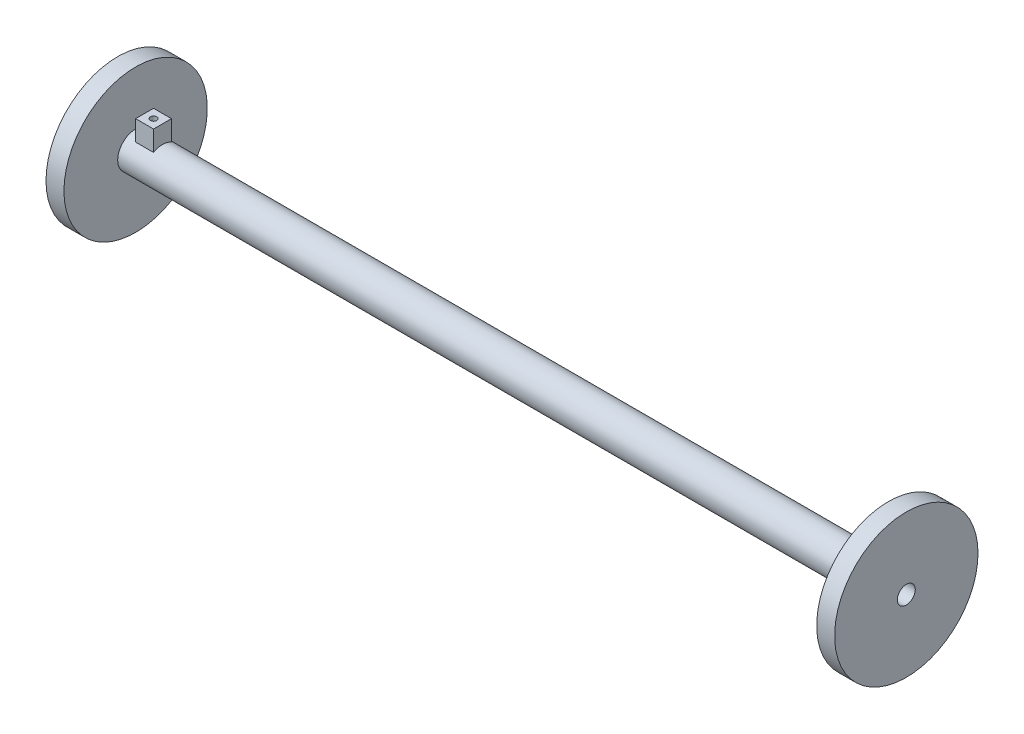
ISO-10303-21;
HEADER;
FILE_DESCRIPTION(('STEP AP214'),'2;1');
FILE_NAME('part.step','',(''),(''),'','','');
FILE_SCHEMA(('AUTOMOTIVE_DESIGN { 1 0 10303 214 1 1 1 1 }'));
ENDSEC;
DATA;
#1=APPLICATION_CONTEXT('core data for automotive mechanical design processes');
#2=APPLICATION_PROTOCOL_DEFINITION('international standard','automotive_design',2000,#1);
#3=PRODUCT_CONTEXT('',#1,'mechanical');
#4=PRODUCT('Part','Part','',(#3));
#5=PRODUCT_RELATED_PRODUCT_CATEGORY('part','',(#4));
#6=PRODUCT_DEFINITION_FORMATION('','',#4);
#7=PRODUCT_DEFINITION_CONTEXT('part definition',#1,'design');
#8=PRODUCT_DEFINITION('design','',#6,#7);
#9=PRODUCT_DEFINITION_SHAPE('','',#8);
#10=(LENGTH_UNIT() NAMED_UNIT(*) SI_UNIT(.MILLI.,.METRE.));
#11=(NAMED_UNIT(*) PLANE_ANGLE_UNIT() SI_UNIT($,.RADIAN.));
#12=(NAMED_UNIT(*) SI_UNIT($,.STERADIAN.) SOLID_ANGLE_UNIT());
#13=UNCERTAINTY_MEASURE_WITH_UNIT(LENGTH_MEASURE(1.E-05),#10,'distance_accuracy_value','');
#14=(GEOMETRIC_REPRESENTATION_CONTEXT(3) GLOBAL_UNCERTAINTY_ASSIGNED_CONTEXT((#13)) GLOBAL_UNIT_ASSIGNED_CONTEXT((#10,
#11,#12)) REPRESENTATION_CONTEXT('',''));
#15=CARTESIAN_POINT('',(0.,0.,0.));
#16=DIRECTION('',(0.,0.,1.));
#17=DIRECTION('',(1.,0.,0.));
#18=AXIS2_PLACEMENT_3D('',#15,#16,#17);
#19=CARTESIAN_POINT('',(279.4,0.,0.));
#20=DIRECTION('',(-1.,0.,0.));
#21=DIRECTION('',(0.,0.,1.));
#22=AXIS2_PLACEMENT_3D('',#19,#20,#21);
#23=CYLINDRICAL_SURFACE('',#22,12.7);
#24=CARTESIAN_POINT('',(-260.35,0.,0.));
#25=DIRECTION('',(-1.,0.,0.));
#26=DIRECTION('',(0.,0.,1.));
#27=AXIS2_PLACEMENT_3D('',#24,#25,#26);
#28=CIRCLE('',#27,12.7);
#29=CARTESIAN_POINT('',(-260.35,10.9985226280624,-6.35));
#30=VERTEX_POINT('',#29);
#31=CARTESIAN_POINT('',(-260.35,10.9985226280624,6.34999999999999));
#32=VERTEX_POINT('',#31);
#33=EDGE_CURVE('E110',#30,#32,#28,.F.);
#34=ORIENTED_EDGE('',*,*,#33,.F.);
#35=DIRECTION('',(-1.,0.,0.));
#36=VECTOR('',#35,1.);
#37=CARTESIAN_POINT('',(279.4,10.9985226280624,-6.35));
#38=LINE('',#37,#36);
#39=CARTESIAN_POINT('',(-247.65,10.9985226280855,-6.35));
#40=VERTEX_POINT('',#39);
#41=EDGE_CURVE('E100',#40,#30,#38,.T.);
#42=ORIENTED_EDGE('',*,*,#41,.F.);
#43=CARTESIAN_POINT('',(-247.65,0.,0.));
#44=DIRECTION('',(1.,0.,0.));
#45=DIRECTION('',(0.,0.,-1.));
#46=AXIS2_PLACEMENT_3D('',#43,#44,#45);
#47=CIRCLE('',#46,12.7);
#48=CARTESIAN_POINT('',(-247.65,10.9985226280855,6.34999999999999));
#49=VERTEX_POINT('',#48);
#50=EDGE_CURVE('E91',#49,#40,#47,.F.);
#51=ORIENTED_EDGE('',*,*,#50,.F.);
#52=DIRECTION('',(-1.,0.,0.));
#53=VECTOR('',#52,1.);
#54=CARTESIAN_POINT('',(279.4,10.9985226280624,6.34999999999999));
#55=LINE('',#54,#53);
#56=EDGE_CURVE('E106',#32,#49,#55,.F.);
#57=ORIENTED_EDGE('',*,*,#56,.F.);
#58=EDGE_LOOP('',(#34,#42,#51,#57));
#59=FACE_BOUND('',#58,.T.);
#60=CARTESIAN_POINT('',(266.7,0.,0.));
#61=DIRECTION('',(1.,0.,0.));
#62=DIRECTION('',(0.,0.,-1.));
#63=AXIS2_PLACEMENT_3D('',#60,#61,#62);
#64=CIRCLE('',#63,12.7);
#65=CARTESIAN_POINT('',(266.7,0.,-12.7));
#66=VERTEX_POINT('',#65);
#67=EDGE_CURVE('E130',#66,#66,#64,.T.);
#68=ORIENTED_EDGE('',*,*,#67,.F.);
#69=EDGE_LOOP('',(#68));
#70=FACE_BOUND('',#69,.T.);
#71=CARTESIAN_POINT('',(-266.7,0.,0.));
#72=DIRECTION('',(-1.,0.,0.));
#73=DIRECTION('',(0.,0.,1.));
#74=AXIS2_PLACEMENT_3D('',#71,#72,#73);
#75=CIRCLE('',#74,12.7);
#76=CARTESIAN_POINT('',(-266.7,0.,12.7));
#77=VERTEX_POINT('',#76);
#78=EDGE_CURVE('E57',#77,#77,#75,.T.);
#79=ORIENTED_EDGE('',*,*,#78,.F.);
#80=EDGE_LOOP('',(#79));
#81=FACE_BOUND('',#80,.T.);
#82=ADVANCED_FACE('F46',(#59,#70,#81),#23,.T.);
#83=CARTESIAN_POINT('',(279.4,0.,0.));
#84=DIRECTION('',(1.,0.,0.));
#85=DIRECTION('',(0.,0.,-1.));
#86=AXIS2_PLACEMENT_3D('',#83,#84,#85);
#87=PLANE('',#86);
#88=CARTESIAN_POINT('',(279.4,0.,0.));
#89=DIRECTION('',(1.,0.,0.));
#90=DIRECTION('',(0.,0.,-1.));
#91=AXIS2_PLACEMENT_3D('',#88,#89,#90);
#92=CIRCLE('',#91,6.35);
#93=CARTESIAN_POINT('',(279.4,0.,-6.35));
#94=VERTEX_POINT('',#93);
#95=EDGE_CURVE('E139',#94,#94,#92,.T.);
#96=ORIENTED_EDGE('',*,*,#95,.F.);
#97=EDGE_LOOP('',(#96));
#98=FACE_BOUND('',#97,.T.);
#99=CARTESIAN_POINT('',(279.4,0.,0.));
#100=DIRECTION('',(1.,0.,0.));
#101=DIRECTION('',(0.,0.,-1.));
#102=AXIS2_PLACEMENT_3D('',#99,#100,#101);
#103=CIRCLE('',#102,50.8);
#104=CARTESIAN_POINT('',(279.4,0.,-50.8));
#105=VERTEX_POINT('',#104);
#106=EDGE_CURVE('E123',#105,#105,#103,.T.);
#107=ORIENTED_EDGE('',*,*,#106,.T.);
#108=EDGE_LOOP('',(#107));
#109=FACE_BOUND('',#108,.T.);
#110=ADVANCED_FACE('F154',(#98,#109),#87,.T.);
#111=CARTESIAN_POINT('',(-279.4,0.,0.));
#112=DIRECTION('',(1.,0.,0.));
#113=DIRECTION('',(0.,0.,-1.));
#114=AXIS2_PLACEMENT_3D('',#111,#112,#113);
#115=PLANE('',#114);
#116=CARTESIAN_POINT('',(-279.4,0.,0.));
#117=DIRECTION('',(1.,0.,0.));
#118=DIRECTION('',(0.,0.,-1.));
#119=AXIS2_PLACEMENT_3D('',#116,#117,#118);
#120=CIRCLE('',#119,6.35);
#121=CARTESIAN_POINT('',(-279.4,0.,-6.35));
#122=VERTEX_POINT('',#121);
#123=EDGE_CURVE('E134',#122,#122,#120,.T.);
#124=ORIENTED_EDGE('',*,*,#123,.T.);
#125=EDGE_LOOP('',(#124));
#126=FACE_BOUND('',#125,.T.);
#127=CARTESIAN_POINT('',(-279.4,0.,0.));
#128=DIRECTION('',(-1.,0.,0.));
#129=DIRECTION('',(0.,0.,1.));
#130=AXIS2_PLACEMENT_3D('',#127,#128,#129);
#131=CIRCLE('',#130,50.8);
#132=CARTESIAN_POINT('',(-279.4,0.,50.8));
#133=VERTEX_POINT('',#132);
#134=EDGE_CURVE('E124',#133,#133,#131,.T.);
#135=ORIENTED_EDGE('',*,*,#134,.T.);
#136=EDGE_LOOP('',(#135));
#137=FACE_BOUND('',#136,.T.);
#138=ADVANCED_FACE('F144',(#126,#137),#115,.F.);
#139=CARTESIAN_POINT('',(279.4,0.,0.));
#140=DIRECTION('',(-1.,0.,0.));
#141=DIRECTION('',(0.,0.,1.));
#142=AXIS2_PLACEMENT_3D('',#139,#140,#141);
#143=CYLINDRICAL_SURFACE('',#142,6.35);
#144=ORIENTED_EDGE('',*,*,#123,.F.);
#145=EDGE_LOOP('',(#144));
#146=FACE_BOUND('',#145,.T.);
#147=ORIENTED_EDGE('',*,*,#95,.T.);
#148=EDGE_LOOP('',(#147));
#149=FACE_BOUND('',#148,.T.);
#150=ADVANCED_FACE('F147',(#146,#149),#143,.F.);
#151=CARTESIAN_POINT('',(266.7,0.,0.));
#152=DIRECTION('',(1.,0.,0.));
#153=DIRECTION('',(0.,0.,-1.));
#154=AXIS2_PLACEMENT_3D('',#151,#152,#153);
#155=PLANE('',#154);
#156=CARTESIAN_POINT('',(266.7,0.,0.));
#157=DIRECTION('',(1.,0.,0.));
#158=DIRECTION('',(0.,0.,-1.));
#159=AXIS2_PLACEMENT_3D('',#156,#157,#158);
#160=CIRCLE('',#159,50.8);
#161=CARTESIAN_POINT('',(266.7,0.,-50.8));
#162=VERTEX_POINT('',#161);
#163=EDGE_CURVE('E131',#162,#162,#160,.T.);
#164=ORIENTED_EDGE('',*,*,#163,.F.);
#165=EDGE_LOOP('',(#164));
#166=FACE_BOUND('',#165,.T.);
#167=ORIENTED_EDGE('',*,*,#67,.T.);
#168=EDGE_LOOP('',(#167));
#169=FACE_BOUND('',#168,.T.);
#170=ADVANCED_FACE('F150',(#166,#169),#155,.F.);
#171=CARTESIAN_POINT('',(266.7,0.,0.));
#172=DIRECTION('',(1.,0.,0.));
#173=DIRECTION('',(0.,0.,-1.));
#174=AXIS2_PLACEMENT_3D('',#171,#172,#173);
#175=CYLINDRICAL_SURFACE('',#174,50.8);
#176=ORIENTED_EDGE('',*,*,#163,.T.);
#177=EDGE_LOOP('',(#176));
#178=FACE_BOUND('',#177,.T.);
#179=ORIENTED_EDGE('',*,*,#106,.F.);
#180=EDGE_LOOP('',(#179));
#181=FACE_BOUND('',#180,.T.);
#182=ADVANCED_FACE('F160',(#178,#181),#175,.T.);
#183=CARTESIAN_POINT('',(-266.7,0.,0.));
#184=DIRECTION('',(-1.,0.,0.));
#185=DIRECTION('',(0.,0.,1.));
#186=AXIS2_PLACEMENT_3D('',#183,#184,#185);
#187=PLANE('',#186);
#188=CARTESIAN_POINT('',(-266.7,0.,0.));
#189=DIRECTION('',(-1.,0.,0.));
#190=DIRECTION('',(0.,0.,1.));
#191=AXIS2_PLACEMENT_3D('',#188,#189,#190);
#192=CIRCLE('',#191,50.8);
#193=CARTESIAN_POINT('',(-266.7,0.,50.8));
#194=VERTEX_POINT('',#193);
#195=EDGE_CURVE('E120',#194,#194,#192,.T.);
#196=ORIENTED_EDGE('',*,*,#195,.F.);
#197=EDGE_LOOP('',(#196));
#198=FACE_BOUND('',#197,.T.);
#199=ORIENTED_EDGE('',*,*,#78,.T.);
#200=EDGE_LOOP('',(#199));
#201=FACE_BOUND('',#200,.T.);
#202=ADVANCED_FACE('F162',(#198,#201),#187,.F.);
#203=CARTESIAN_POINT('',(-266.7,0.,0.));
#204=DIRECTION('',(-1.,0.,0.));
#205=DIRECTION('',(0.,0.,1.));
#206=AXIS2_PLACEMENT_3D('',#203,#204,#205);
#207=CYLINDRICAL_SURFACE('',#206,50.8);
#208=ORIENTED_EDGE('',*,*,#195,.T.);
#209=EDGE_LOOP('',(#208));
#210=FACE_BOUND('',#209,.T.);
#211=ORIENTED_EDGE('',*,*,#134,.F.);
#212=EDGE_LOOP('',(#211));
#213=FACE_BOUND('',#212,.T.);
#214=ADVANCED_FACE('F169',(#210,#213),#207,.T.);
#215=CARTESIAN_POINT('',(-260.35,-500000.,-6.35));
#216=DIRECTION('',(0.,0.,-1.));
#217=DIRECTION('',(-1.,0.,0.));
#218=AXIS2_PLACEMENT_3D('',#215,#216,#217);
#219=PLANE('',#218);
#220=DIRECTION('',(0.,1.,0.));
#221=VECTOR('',#220,1.);
#222=CARTESIAN_POINT('',(-247.65,-500000.,-6.35));
#223=LINE('',#222,#221);
#224=CARTESIAN_POINT('',(-247.65,25.4,-6.35));
#225=VERTEX_POINT('',#224);
#226=EDGE_CURVE('E95',#40,#225,#223,.T.);
#227=ORIENTED_EDGE('',*,*,#226,.F.);
#228=ORIENTED_EDGE('',*,*,#41,.T.);
#229=DIRECTION('',(0.,1.,0.));
#230=VECTOR('',#229,1.);
#231=CARTESIAN_POINT('',(-260.35,-500000.,-6.35));
#232=LINE('',#231,#230);
#233=CARTESIAN_POINT('',(-260.35,25.4,-6.35));
#234=VERTEX_POINT('',#233);
#235=EDGE_CURVE('E72',#30,#234,#232,.T.);
#236=ORIENTED_EDGE('',*,*,#235,.T.);
#237=DIRECTION('',(-1.,0.,0.));
#238=VECTOR('',#237,1.);
#239=CARTESIAN_POINT('',(-260.35,25.4,-6.35));
#240=LINE('',#239,#238);
#241=EDGE_CURVE('E104',#225,#234,#240,.T.);
#242=ORIENTED_EDGE('',*,*,#241,.F.);
#243=EDGE_LOOP('',(#227,#228,#236,#242));
#244=FACE_BOUND('',#243,.T.);
#245=ADVANCED_FACE('F102',(#244),#219,.T.);
#246=CARTESIAN_POINT('',(-247.65,25.4,-6.35));
#247=DIRECTION('',(0.,-1.,0.));
#248=DIRECTION('',(0.,0.,-1.));
#249=AXIS2_PLACEMENT_3D('',#246,#247,#248);
#250=PLANE('',#249);
#251=DIRECTION('',(0.,0.,-1.));
#252=VECTOR('',#251,1.);
#253=CARTESIAN_POINT('',(-247.65,25.4,6.34999999999999));
#254=LINE('',#253,#252);
#255=CARTESIAN_POINT('',(-247.65,25.4,6.34999999999999));
#256=VERTEX_POINT('',#255);
#257=EDGE_CURVE('E127',#256,#225,#254,.T.);
#258=ORIENTED_EDGE('',*,*,#257,.T.);
#259=ORIENTED_EDGE('',*,*,#241,.T.);
#260=DIRECTION('',(0.,0.,1.));
#261=VECTOR('',#260,1.);
#262=CARTESIAN_POINT('',(-260.35,25.4,6.34999999999999));
#263=LINE('',#262,#261);
#264=CARTESIAN_POINT('',(-260.35,25.4,6.34999999999999));
#265=VERTEX_POINT('',#264);
#266=EDGE_CURVE('E210',#234,#265,#263,.T.);
#267=ORIENTED_EDGE('',*,*,#266,.T.);
#268=DIRECTION('',(1.,0.,0.));
#269=VECTOR('',#268,1.);
#270=CARTESIAN_POINT('',(-260.35,25.4,6.34999999999999));
#271=LINE('',#270,#269);
#272=EDGE_CURVE('E212',#265,#256,#271,.T.);
#273=ORIENTED_EDGE('',*,*,#272,.T.);
#274=EDGE_LOOP('',(#258,#259,#267,#273));
#275=FACE_BOUND('',#274,.T.);
#276=CARTESIAN_POINT('',(-254.,25.4,0.));
#277=DIRECTION('',(0.,1.,0.));
#278=DIRECTION('',(0.,0.,1.));
#279=AXIS2_PLACEMENT_3D('',#276,#277,#278);
#280=CIRCLE('',#279,2.28600000000004);
#281=CARTESIAN_POINT('',(-254.,25.4,2.28600000000003));
#282=VERTEX_POINT('',#281);
#283=EDGE_CURVE('E117',#282,#282,#280,.T.);
#284=ORIENTED_EDGE('',*,*,#283,.F.);
#285=EDGE_LOOP('',(#284));
#286=FACE_BOUND('',#285,.T.);
#287=ADVANCED_FACE('F188',(#275,#286),#250,.F.);
#288=CARTESIAN_POINT('',(-254.,-500000.,0.));
#289=DIRECTION('',(0.,1.,0.));
#290=DIRECTION('',(0.,0.,1.));
#291=AXIS2_PLACEMENT_3D('',#288,#289,#290);
#292=CYLINDRICAL_SURFACE('',#291,2.28600000000004);
#293=ORIENTED_EDGE('',*,*,#283,.T.);
#294=EDGE_LOOP('',(#293));
#295=FACE_BOUND('',#294,.T.);
#296=CARTESIAN_POINT('',(-254.,12.4925659493957,2.28600000000003));
#297=CARTESIAN_POINT('',(-254.12728462861,12.4925683601122,2.28599502560256));
#298=CARTESIAN_POINT('',(-254.254634908737,12.4945323807389,2.27533313099571));
#299=CARTESIAN_POINT('',(-254.505751129904,12.5021674585985,2.23299218014049));
#300=CARTESIAN_POINT('',(-254.62951383246,12.5078417625423,2.20129471619883));
#301=CARTESIAN_POINT('',(-254.8697848494,12.5222343967377,2.11788199725785));
#302=CARTESIAN_POINT('',(-254.986299553349,12.5309499997664,2.06618467222844));
#303=CARTESIAN_POINT('',(-255.208992512898,12.5504399789036,1.94428621573641));
#304=CARTESIAN_POINT('',(-255.315171706166,12.5612141679878,1.87408676498888));
#305=CARTESIAN_POINT('',(-255.515408016439,12.5837454897839,1.71631768436704));
#306=CARTESIAN_POINT('',(-255.609329276534,12.5955115896813,1.62857688410405));
#307=CARTESIAN_POINT('',(-255.78120131409,12.618621623506,1.43858569949088));
#308=CARTESIAN_POINT('',(-255.859151082004,12.6299655307097,1.33633439863273));
#309=CARTESIAN_POINT('',(-255.997384132095,12.6510486777033,1.119336774867));
#310=CARTESIAN_POINT('',(-256.057539922915,12.6607761283665,1.00450799333298));
#311=CARTESIAN_POINT('',(-256.157656753579,12.6774301820131,0.766170119418902));
#312=CARTESIAN_POINT('',(-256.197619323596,12.6843569972111,0.642661685561252));
#313=CARTESIAN_POINT('',(-256.25579688568,12.6945659898205,0.391876857543688));
#314=CARTESIAN_POINT('',(-256.274240643691,12.6978864792749,0.264655118225859));
#315=CARTESIAN_POINT('',(-256.289569296453,12.700640587672,0.0088825037627158));
#316=CARTESIAN_POINT('',(-256.286455888978,12.7000745127081,-0.119668265916201));
#317=CARTESIAN_POINT('',(-256.258935140036,12.6951493577789,-0.372882767292602));
#318=CARTESIAN_POINT('',(-256.234774073771,12.6908341473823,-0.497574241629382));
#319=CARTESIAN_POINT('',(-256.166232717676,12.6789446608929,-0.741103772126463));
#320=CARTESIAN_POINT('',(-256.121851734573,12.6713702730545,-0.859941627431133));
#321=CARTESIAN_POINT('',(-256.013891955978,12.6537396365121,-1.08911162459867));
#322=CARTESIAN_POINT('',(-255.950213585685,12.6436705655846,-1.19939583103152));
#323=CARTESIAN_POINT('',(-255.80553983543,12.6221660476651,-1.40780577996559));
#324=CARTESIAN_POINT('',(-255.724542827782,12.6107304722873,-1.50593037827962));
#325=CARTESIAN_POINT('',(-255.546170555356,12.587570680953,-1.68869340756984));
#326=CARTESIAN_POINT('',(-255.44857990012,12.5758446700341,-1.77312152928976));
#327=CARTESIAN_POINT('',(-255.240511124322,12.5535808416785,-1.92444164965209));
#328=CARTESIAN_POINT('',(-255.130032843246,12.543043039044,-1.99133342984788));
#329=CARTESIAN_POINT('',(-254.899059132594,12.5243467387956,-2.10573500778741));
#330=CARTESIAN_POINT('',(-254.778549234395,12.5161917570919,-2.15321620552977));
#331=CARTESIAN_POINT('',(-254.531083369058,12.5032397630046,-2.2272000355141));
#332=CARTESIAN_POINT('',(-254.404128072344,12.4984424021398,-2.25370484489318));
#333=CARTESIAN_POINT('',(-254.149266157028,12.4928172285622,-2.28468055399085));
#334=CARTESIAN_POINT('',(-254.021397316168,12.4919351443415,-2.28945272445529));
#335=CARTESIAN_POINT('',(-253.766689260307,12.4940954196608,-2.27763351307604));
#336=CARTESIAN_POINT('',(-253.639849998846,12.4971376011125,-2.26104310069323));
#337=CARTESIAN_POINT('',(-253.391779525225,12.5067532303968,-2.20722764973207));
#338=CARTESIAN_POINT('',(-253.270513293855,12.5132999322248,-2.1701588317604));
#339=CARTESIAN_POINT('',(-253.03591335946,12.5291641378032,-2.07660385525053));
#340=CARTESIAN_POINT('',(-252.922580201348,12.5384818316592,-2.02011636444095));
#341=CARTESIAN_POINT('',(-252.705731209036,12.5589626815312,-1.888627558456));
#342=CARTESIAN_POINT('',(-252.602333191791,12.5701444897845,-1.8134349009189));
#343=CARTESIAN_POINT('',(-252.409513660521,12.5930404286277,-1.64692993047906));
#344=CARTESIAN_POINT('',(-252.320093301586,12.6047546031083,-1.555616286692));
#345=CARTESIAN_POINT('',(-252.156651356835,12.6275687702904,-1.35811983274086));
#346=CARTESIAN_POINT('',(-252.082831759667,12.6386594847352,-1.25176862469956));
#347=CARTESIAN_POINT('',(-251.954108332984,12.6588237860434,-1.02799894479395));
#348=CARTESIAN_POINT('',(-251.899203816522,12.667897446157,-0.910580875048029));
#349=CARTESIAN_POINT('',(-251.810175944754,12.6829652235525,-0.668584217920632));
#350=CARTESIAN_POINT('',(-251.775950979495,12.6889743753187,-0.544043988538945));
#351=CARTESIAN_POINT('',(-251.728928293225,12.6972999940264,-0.290865376519061));
#352=CARTESIAN_POINT('',(-251.716128501948,12.6996168177481,-0.162227391061922));
#353=CARTESIAN_POINT('',(-251.71238693109,12.7002904080924,0.0935535205869128));
#354=CARTESIAN_POINT('',(-251.72113925305,12.6987025953401,0.220691928253398));
#355=CARTESIAN_POINT('',(-251.759586600325,12.6918597224372,0.471655663394245));
#356=CARTESIAN_POINT('',(-251.789281457782,12.68660469168,0.595481017414973));
#357=CARTESIAN_POINT('',(-251.868646242199,12.6730169108186,0.836158661834528));
#358=CARTESIAN_POINT('',(-251.91828603213,12.6646888057089,0.95302116862489));
#359=CARTESIAN_POINT('',(-252.036095956845,12.6458592147902,1.17680485929716));
#360=CARTESIAN_POINT('',(-252.104267200795,12.6353575988987,1.28372544760999));
#361=CARTESIAN_POINT('',(-252.258269693888,12.6131661845231,1.48612093140229));
#362=CARTESIAN_POINT('',(-252.344323104202,12.6014624785955,1.58142527912794));
#363=CARTESIAN_POINT('',(-252.531183961309,12.5782768391035,1.7563476164931));
#364=CARTESIAN_POINT('',(-252.631994864935,12.5667949582153,1.83596192057637));
#365=CARTESIAN_POINT('',(-252.846522139047,12.5452478083021,1.9778693183712));
#366=CARTESIAN_POINT('',(-252.960340017168,12.5351952798425,2.04001093854831));
#367=CARTESIAN_POINT('',(-253.196940383025,12.5177971846599,2.14419370807444));
#368=CARTESIAN_POINT('',(-253.319714090865,12.5104490083334,2.18625424666793));
#369=CARTESIAN_POINT('',(-253.535745957728,12.5008604553579,2.24031233001533));
#370=CARTESIAN_POINT('',(-253.62772230512,12.4977680414048,2.25741655472956));
#371=CARTESIAN_POINT('',(-253.813120660022,12.4936199274035,2.28026208201763));
#372=CARTESIAN_POINT('',(-253.906542633407,12.492564179353,2.28600365239776));
#373=CARTESIAN_POINT('',(-254.,12.4925659493957,2.28600000000003));
#374=B_SPLINE_CURVE_WITH_KNOTS('',3,(#296,#297,#298,#299,#300,#301,#302,#303,#304,#305,#306,
#307,#308,#309,#310,#311,#312,#313,#314,#315,#316,#317,#318,#319,#320,#321,#322,#323,#324,#325,
#326,#327,#328,#329,#330,#331,#332,#333,#334,#335,#336,#337,#338,#339,#340,#341,#342,#343,#344,
#345,#346,#347,#348,#349,#350,#351,#352,#353,#354,#355,#356,#357,#358,#359,#360,#361,#362,#363,
#364,#365,#366,#367,#368,#369,#370,#371,#372,#373),.UNSPECIFIED.,.T.,.F.,(4,2,2,2,2,2,2,2,2,2,2,
2,2,2,2,2,2,2,2,2,2,2,2,2,2,2,2,2,2,2,2,2,2,2,2,2,2,2,4),(0.,0.381511974244366,0.763358240939,
1.14486297099566,1.52633305747098,1.911725219604,2.29714173460634,2.68525629710005,
3.07334144519181,3.45726215281491,3.8411526244125,4.22061068961157,4.60008176612395,
4.98154525899731,5.36304461937162,5.74993828350754,6.13683676686955,6.52430327842129,
6.91172956958916,7.29376844511122,7.6757899838397,8.05493670801458,8.43410944978501,
8.8173330231086,9.2005882486486,9.58853693515604,9.97647153083908,10.3624841537094,
10.7484594749036,11.1289881411699,11.5095137574764,11.8894665444615,12.2694420778151,
12.6544555087424,13.0395592709513,13.4279052885413,13.8158755773362,14.0960032346227,
14.3761242895041),.UNSPECIFIED.);
#375=CARTESIAN_POINT('',(-254.,12.4925659493957,2.28600000000003));
#376=VERTEX_POINT('',#375);
#377=EDGE_CURVE('E12',#376,#376,#374,.T.);
#378=ORIENTED_EDGE('',*,*,#377,.T.);
#379=EDGE_LOOP('',(#378));
#380=FACE_BOUND('',#379,.T.);
#381=ADVANCED_FACE('F194',(#295,#380),#292,.F.);
#382=CARTESIAN_POINT('',(-247.65,-500000.,6.34999999999999));
#383=DIRECTION('',(1.,0.,0.));
#384=DIRECTION('',(0.,0.,-1.));
#385=AXIS2_PLACEMENT_3D('',#382,#383,#384);
#386=PLANE('',#385);
#387=DIRECTION('',(0.,1.,0.));
#388=VECTOR('',#387,1.);
#389=CARTESIAN_POINT('',(-247.65,-500000.,6.34999999999999));
#390=LINE('',#389,#388);
#391=EDGE_CURVE('E96',#49,#256,#390,.T.);
#392=ORIENTED_EDGE('',*,*,#391,.F.);
#393=ORIENTED_EDGE('',*,*,#50,.T.);
#394=ORIENTED_EDGE('',*,*,#226,.T.);
#395=ORIENTED_EDGE('',*,*,#257,.F.);
#396=EDGE_LOOP('',(#392,#393,#394,#395));
#397=FACE_BOUND('',#396,.T.);
#398=ADVANCED_FACE('F93',(#397),#386,.T.);
#399=CARTESIAN_POINT('',(-260.35,-500000.,6.34999999999999));
#400=DIRECTION('',(-1.,0.,0.));
#401=DIRECTION('',(0.,0.,1.));
#402=AXIS2_PLACEMENT_3D('',#399,#400,#401);
#403=PLANE('',#402);
#404=ORIENTED_EDGE('',*,*,#235,.F.);
#405=ORIENTED_EDGE('',*,*,#33,.T.);
#406=DIRECTION('',(0.,1.,0.));
#407=VECTOR('',#406,1.);
#408=CARTESIAN_POINT('',(-260.35,-500000.,6.34999999999999));
#409=LINE('',#408,#407);
#410=EDGE_CURVE('E64',#32,#265,#409,.T.);
#411=ORIENTED_EDGE('',*,*,#410,.T.);
#412=ORIENTED_EDGE('',*,*,#266,.F.);
#413=EDGE_LOOP('',(#404,#405,#411,#412));
#414=FACE_BOUND('',#413,.T.);
#415=ADVANCED_FACE('F184',(#414),#403,.T.);
#416=CARTESIAN_POINT('',(-260.35,-500000.,6.34999999999999));
#417=DIRECTION('',(0.,0.,1.));
#418=DIRECTION('',(1.,0.,0.));
#419=AXIS2_PLACEMENT_3D('',#416,#417,#418);
#420=PLANE('',#419);
#421=ORIENTED_EDGE('',*,*,#410,.F.);
#422=ORIENTED_EDGE('',*,*,#56,.T.);
#423=ORIENTED_EDGE('',*,*,#391,.T.);
#424=ORIENTED_EDGE('',*,*,#272,.F.);
#425=EDGE_LOOP('',(#421,#422,#423,#424));
#426=FACE_BOUND('',#425,.T.);
#427=ADVANCED_FACE('F179',(#426),#420,.T.);
#428=ORIENTED_EDGE('',*,*,#377,.F.);
#429=EDGE_LOOP('',(#428));
#430=FACE_BOUND('',#429,.T.);
#431=ADVANCED_FACE('F175',(#430),#23,.T.);
#432=CLOSED_SHELL('',(#82,#110,#138,#150,#170,#182,#202,#214,#245,#287,#381,#398,#415,#427,#431));
#433=MANIFOLD_SOLID_BREP('B2',#432);
#434=ADVANCED_BREP_SHAPE_REPRESENTATION('',(#18,#433),#14);
#435=SHAPE_DEFINITION_REPRESENTATION(#9,#434);
ENDSEC;
END-ISO-10303-21;
